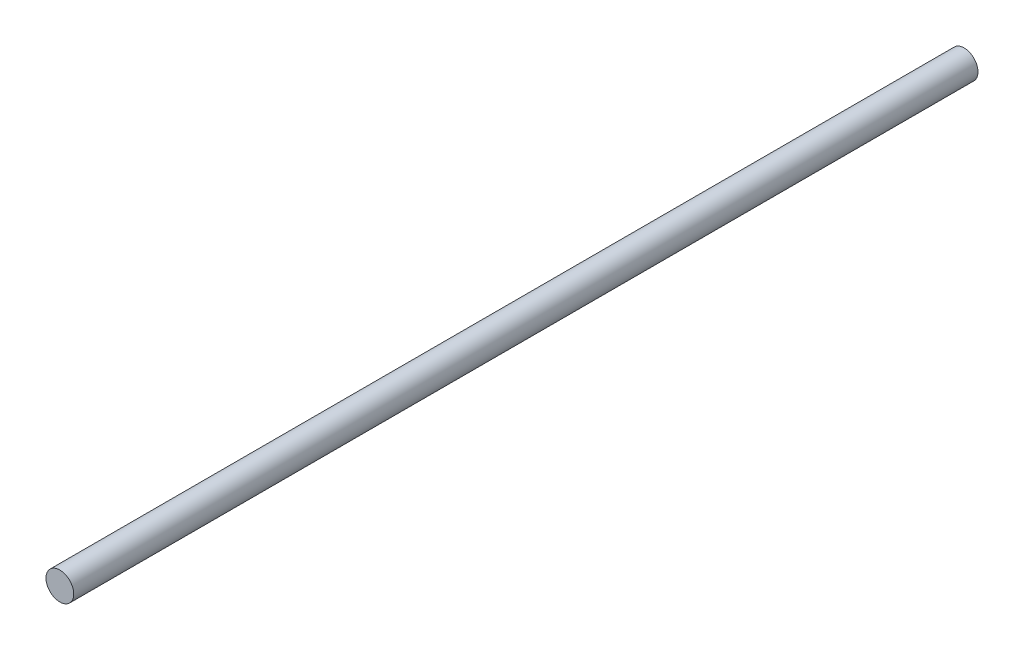
ISO-10303-21;
HEADER;
FILE_DESCRIPTION(('STEP AP214'),'2;1');
FILE_NAME('part.step','',(''),(''),'','','');
FILE_SCHEMA(('AUTOMOTIVE_DESIGN { 1 0 10303 214 1 1 1 1 }'));
ENDSEC;
DATA;
#1=APPLICATION_CONTEXT('core data for automotive mechanical design processes');
#2=APPLICATION_PROTOCOL_DEFINITION('international standard','automotive_design',2000,#1);
#3=PRODUCT_CONTEXT('',#1,'mechanical');
#4=PRODUCT('Part','Part','',(#3));
#5=PRODUCT_RELATED_PRODUCT_CATEGORY('part','',(#4));
#6=PRODUCT_DEFINITION_FORMATION('','',#4);
#7=PRODUCT_DEFINITION_CONTEXT('part definition',#1,'design');
#8=PRODUCT_DEFINITION('design','',#6,#7);
#9=PRODUCT_DEFINITION_SHAPE('','',#8);
#10=(LENGTH_UNIT() NAMED_UNIT(*) SI_UNIT(.MILLI.,.METRE.));
#11=(NAMED_UNIT(*) PLANE_ANGLE_UNIT() SI_UNIT($,.RADIAN.));
#12=(NAMED_UNIT(*) SI_UNIT($,.STERADIAN.) SOLID_ANGLE_UNIT());
#13=UNCERTAINTY_MEASURE_WITH_UNIT(LENGTH_MEASURE(1.E-05),#10,'distance_accuracy_value','');
#14=(GEOMETRIC_REPRESENTATION_CONTEXT(3) GLOBAL_UNCERTAINTY_ASSIGNED_CONTEXT((#13)) GLOBAL_UNIT_ASSIGNED_CONTEXT((#10,
#11,#12)) REPRESENTATION_CONTEXT('',''));
#15=CARTESIAN_POINT('',(0.,0.,0.));
#16=DIRECTION('',(0.,0.,1.));
#17=DIRECTION('',(1.,0.,0.));
#18=AXIS2_PLACEMENT_3D('',#15,#16,#17);
#19=CARTESIAN_POINT('',(0.,0.,-587.));
#20=DIRECTION('',(0.,0.,1.));
#21=DIRECTION('',(1.,0.,0.));
#22=AXIS2_PLACEMENT_3D('',#19,#20,#21);
#23=CYLINDRICAL_SURFACE('',#22,9.);
#24=CARTESIAN_POINT('',(0.,0.,-587.));
#25=DIRECTION('',(0.,0.,1.));
#26=DIRECTION('',(1.,0.,0.));
#27=AXIS2_PLACEMENT_3D('',#24,#25,#26);
#28=CIRCLE('',#27,9.);
#29=CARTESIAN_POINT('',(9.,0.,-587.));
#30=VERTEX_POINT('',#29);
#31=EDGE_CURVE('E10',#30,#30,#28,.T.);
#32=CARTESIAN_POINT('',(0.,0.,0.));
#33=DIRECTION('',(0.,0.,1.));
#34=DIRECTION('',(1.,0.,0.));
#35=AXIS2_PLACEMENT_3D('',#32,#33,#34);
#36=CIRCLE('',#35,9.);
#37=CARTESIAN_POINT('',(9.,0.,-1.11022302462516E-13));
#38=VERTEX_POINT('',#37);
#39=EDGE_CURVE('E38',#38,#38,#36,.T.);
#40=CARTESIAN_POINT('',(9.,0.,-587.));
#41=CARTESIAN_POINT('',(9.,0.,-580.885416666667));
#42=CARTESIAN_POINT('',(9.,0.,-574.770833333333));
#43=CARTESIAN_POINT('',(9.,0.,-562.541666666667));
#44=CARTESIAN_POINT('',(9.,0.,-556.427083333333));
#45=CARTESIAN_POINT('',(9.,0.,-544.197916666667));
#46=CARTESIAN_POINT('',(9.,0.,-538.083333333333));
#47=CARTESIAN_POINT('',(9.,0.,-525.854166666667));
#48=CARTESIAN_POINT('',(9.,0.,-519.739583333333));
#49=CARTESIAN_POINT('',(9.,0.,-507.510416666667));
#50=CARTESIAN_POINT('',(9.,0.,-501.395833333333));
#51=CARTESIAN_POINT('',(9.,0.,-489.166666666667));
#52=CARTESIAN_POINT('',(9.,0.,-483.052083333333));
#53=CARTESIAN_POINT('',(9.,0.,-470.822916666667));
#54=CARTESIAN_POINT('',(9.,0.,-464.708333333333));
#55=CARTESIAN_POINT('',(9.,0.,-452.479166666667));
#56=CARTESIAN_POINT('',(9.,0.,-446.364583333333));
#57=CARTESIAN_POINT('',(9.,0.,-434.135416666667));
#58=CARTESIAN_POINT('',(9.,0.,-428.020833333333));
#59=CARTESIAN_POINT('',(9.,0.,-415.791666666667));
#60=CARTESIAN_POINT('',(9.,0.,-409.677083333333));
#61=CARTESIAN_POINT('',(9.,0.,-397.447916666667));
#62=CARTESIAN_POINT('',(9.,0.,-391.333333333333));
#63=CARTESIAN_POINT('',(9.,0.,-379.104166666667));
#64=CARTESIAN_POINT('',(9.,0.,-372.989583333333));
#65=CARTESIAN_POINT('',(9.,0.,-360.760416666667));
#66=CARTESIAN_POINT('',(9.,0.,-354.645833333333));
#67=CARTESIAN_POINT('',(9.,0.,-342.416666666667));
#68=CARTESIAN_POINT('',(9.,0.,-336.302083333333));
#69=CARTESIAN_POINT('',(9.,0.,-324.072916666667));
#70=CARTESIAN_POINT('',(9.,0.,-317.958333333333));
#71=CARTESIAN_POINT('',(9.,0.,-305.729166666667));
#72=CARTESIAN_POINT('',(9.,0.,-299.614583333333));
#73=CARTESIAN_POINT('',(9.,0.,-287.385416666667));
#74=CARTESIAN_POINT('',(9.,0.,-281.270833333333));
#75=CARTESIAN_POINT('',(9.,0.,-269.041666666667));
#76=CARTESIAN_POINT('',(9.,0.,-262.927083333333));
#77=CARTESIAN_POINT('',(9.,0.,-250.697916666667));
#78=CARTESIAN_POINT('',(9.,0.,-244.583333333333));
#79=CARTESIAN_POINT('',(9.,0.,-232.354166666667));
#80=CARTESIAN_POINT('',(9.,0.,-226.239583333333));
#81=CARTESIAN_POINT('',(9.,0.,-214.010416666667));
#82=CARTESIAN_POINT('',(9.,0.,-207.895833333333));
#83=CARTESIAN_POINT('',(9.,0.,-195.666666666667));
#84=CARTESIAN_POINT('',(9.,0.,-189.552083333333));
#85=CARTESIAN_POINT('',(9.,0.,-177.322916666667));
#86=CARTESIAN_POINT('',(9.,0.,-171.208333333333));
#87=CARTESIAN_POINT('',(9.,0.,-158.979166666667));
#88=CARTESIAN_POINT('',(9.,0.,-152.864583333333));
#89=CARTESIAN_POINT('',(9.,0.,-140.635416666667));
#90=CARTESIAN_POINT('',(9.,0.,-134.520833333333));
#91=CARTESIAN_POINT('',(9.,0.,-122.291666666667));
#92=CARTESIAN_POINT('',(9.,0.,-116.177083333333));
#93=CARTESIAN_POINT('',(9.,0.,-103.947916666667));
#94=CARTESIAN_POINT('',(9.,0.,-97.8333333333333));
#95=CARTESIAN_POINT('',(9.,0.,-85.6041666666667));
#96=CARTESIAN_POINT('',(9.,0.,-79.4895833333334));
#97=CARTESIAN_POINT('',(9.,0.,-67.2604166666668));
#98=CARTESIAN_POINT('',(9.,0.,-61.1458333333334));
#99=CARTESIAN_POINT('',(9.,0.,-48.9166666666668));
#100=CARTESIAN_POINT('',(9.,0.,-42.8020833333334));
#101=CARTESIAN_POINT('',(9.,0.,-30.5729166666668));
#102=CARTESIAN_POINT('',(9.,0.,-24.4583333333334));
#103=CARTESIAN_POINT('',(9.,0.,-12.2291666666668));
#104=CARTESIAN_POINT('',(9.,0.,-6.11458333333344));
#105=CARTESIAN_POINT('',(9.,0.,-1.11022302462516E-13));
#106=B_SPLINE_CURVE_WITH_KNOTS('',3,(#40,#41,#42,#43,#44,#45,#46,#47,#48,#49,#50,#51,#52,#53,
#54,#55,#56,#57,#58,#59,#60,#61,#62,#63,#64,#65,#66,#67,#68,#69,#70,#71,#72,#73,#74,#75,#76,#77,
#78,#79,#80,#81,#82,#83,#84,#85,#86,#87,#88,#89,#90,#91,#92,#93,#94,#95,#96,#97,#98,#99,#100,
#101,#102,#103,#104,#105),.UNSPECIFIED.,.F.,.F.,(4,2,2,2,2,2,2,2,2,2,2,2,2,2,2,2,2,2,2,2,2,2,2,
2,2,2,2,2,2,2,2,2,4),(0.,18.3437500000001,36.6875000000001,55.0312500000001,73.3750000000001,
91.7187500000001,110.0625,128.40625,146.75,165.09375,183.4375,201.78125,220.125,238.46875,
256.8125,275.15625,293.5,311.84375,330.1875,348.53125,366.875,385.21875,403.5625,421.90625,
440.25,458.59375,476.9375,495.28125,513.625,531.96875,550.3125,568.65625,587.),.UNSPECIFIED.);
#107=EDGE_CURVE('BSEAM35',#30,#38,#106,.T.);
#108=ORIENTED_EDGE('',*,*,#31,.T.);
#109=ORIENTED_EDGE('',*,*,#39,.F.);
#110=ORIENTED_EDGE('',*,*,#107,.T.);
#111=ORIENTED_EDGE('',*,*,#107,.F.);
#112=EDGE_LOOP('',(#108,#110,#109,#111));
#113=FACE_BOUND('',#112,.T.);
#114=ADVANCED_FACE('F35',(#113),#23,.T.);
#115=CARTESIAN_POINT('',(0.,0.,-587.));
#116=DIRECTION('',(0.,0.,1.));
#117=DIRECTION('',(1.,0.,0.));
#118=AXIS2_PLACEMENT_3D('',#115,#116,#117);
#119=PLANE('',#118);
#120=ORIENTED_EDGE('',*,*,#31,.F.);
#121=EDGE_LOOP('',(#120));
#122=FACE_BOUND('',#121,.T.);
#123=ADVANCED_FACE('F50',(#122),#119,.F.);
#124=CARTESIAN_POINT('',(0.,0.,0.));
#125=DIRECTION('',(0.,0.,1.));
#126=DIRECTION('',(1.,0.,0.));
#127=AXIS2_PLACEMENT_3D('',#124,#125,#126);
#128=PLANE('',#127);
#129=ORIENTED_EDGE('',*,*,#39,.T.);
#130=EDGE_LOOP('',(#129));
#131=FACE_BOUND('',#130,.T.);
#132=ADVANCED_FACE('F47',(#131),#128,.T.);
#133=CLOSED_SHELL('',(#114,#123,#132));
#134=MANIFOLD_SOLID_BREP('B2',#133);
#135=ADVANCED_BREP_SHAPE_REPRESENTATION('',(#18,#134),#14);
#136=SHAPE_DEFINITION_REPRESENTATION(#9,#135);
ENDSEC;
END-ISO-10303-21;
